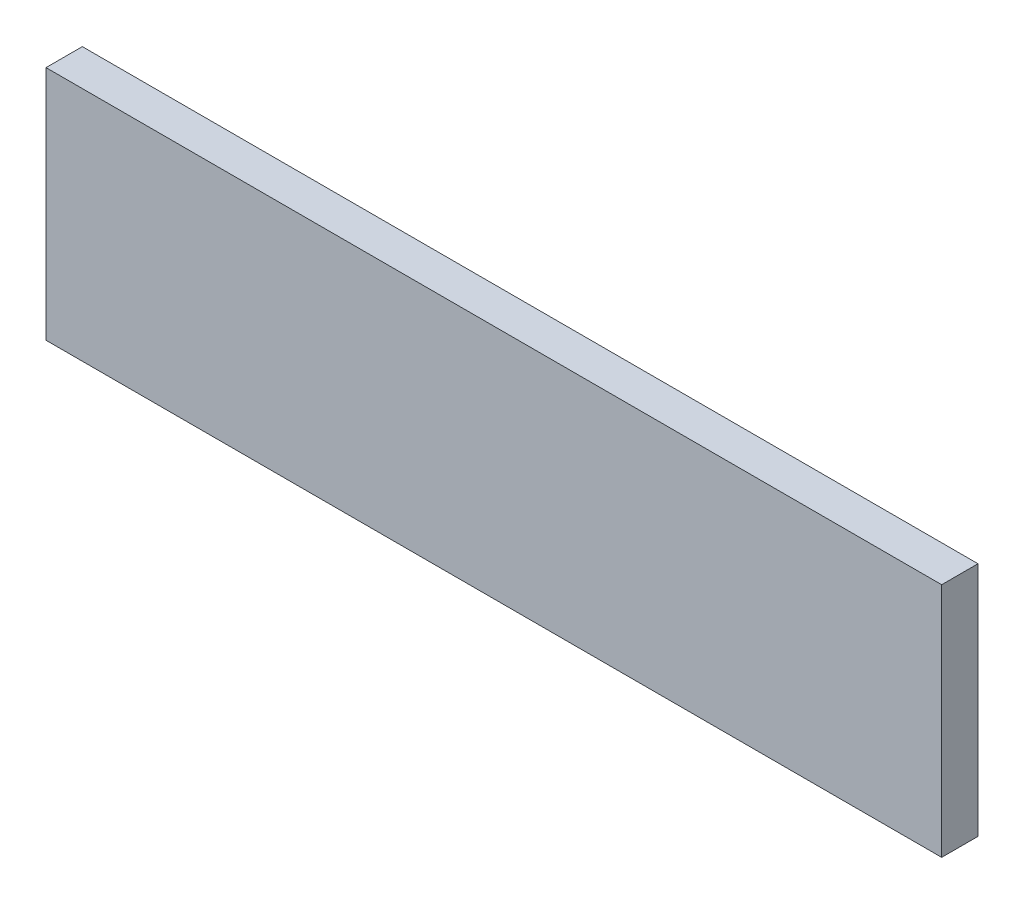
ISO-10303-21;
HEADER;
FILE_DESCRIPTION(('STEP AP214'),'2;1');
FILE_NAME('part.step','',(''),(''),'','','');
FILE_SCHEMA(('AUTOMOTIVE_DESIGN { 1 0 10303 214 1 1 1 1 }'));
ENDSEC;
DATA;
#1=APPLICATION_CONTEXT('core data for automotive mechanical design processes');
#2=APPLICATION_PROTOCOL_DEFINITION('international standard','automotive_design',2000,#1);
#3=PRODUCT_CONTEXT('',#1,'mechanical');
#4=PRODUCT('Part','Part','',(#3));
#5=PRODUCT_RELATED_PRODUCT_CATEGORY('part','',(#4));
#6=PRODUCT_DEFINITION_FORMATION('','',#4);
#7=PRODUCT_DEFINITION_CONTEXT('part definition',#1,'design');
#8=PRODUCT_DEFINITION('design','',#6,#7);
#9=PRODUCT_DEFINITION_SHAPE('','',#8);
#10=(LENGTH_UNIT() NAMED_UNIT(*) SI_UNIT(.MILLI.,.METRE.));
#11=(NAMED_UNIT(*) PLANE_ANGLE_UNIT() SI_UNIT($,.RADIAN.));
#12=(NAMED_UNIT(*) SI_UNIT($,.STERADIAN.) SOLID_ANGLE_UNIT());
#13=UNCERTAINTY_MEASURE_WITH_UNIT(LENGTH_MEASURE(1.E-05),#10,'distance_accuracy_value','');
#14=(GEOMETRIC_REPRESENTATION_CONTEXT(3) GLOBAL_UNCERTAINTY_ASSIGNED_CONTEXT((#13)) GLOBAL_UNIT_ASSIGNED_CONTEXT((#10,
#11,#12)) REPRESENTATION_CONTEXT('',''));
#15=CARTESIAN_POINT('',(0.,0.,0.));
#16=DIRECTION('',(0.,0.,1.));
#17=DIRECTION('',(1.,0.,0.));
#18=AXIS2_PLACEMENT_3D('',#15,#16,#17);
#19=CARTESIAN_POINT('',(156.549999955,41.275,12.7));
#20=DIRECTION('',(-1.,0.,0.));
#21=DIRECTION('',(0.,0.,1.));
#22=AXIS2_PLACEMENT_3D('',#19,#20,#21);
#23=PLANE('',#22);
#24=DIRECTION('',(0.,1.,0.));
#25=VECTOR('',#24,1.);
#26=CARTESIAN_POINT('',(156.549999955,41.275,0.));
#27=LINE('',#26,#25);
#28=CARTESIAN_POINT('',(156.549999955,-41.275,0.));
#29=VERTEX_POINT('',#28);
#30=CARTESIAN_POINT('',(156.549999955,41.275,0.));
#31=VERTEX_POINT('',#30);
#32=EDGE_CURVE('E106',#29,#31,#27,.T.);
#33=ORIENTED_EDGE('',*,*,#32,.T.);
#34=DIRECTION('',(0.,0.,-1.));
#35=VECTOR('',#34,1.);
#36=CARTESIAN_POINT('',(156.549999955,41.275,12.7));
#37=LINE('',#36,#35);
#38=CARTESIAN_POINT('',(156.549999955,41.275,12.7));
#39=VERTEX_POINT('',#38);
#40=EDGE_CURVE('E11',#39,#31,#37,.T.);
#41=ORIENTED_EDGE('',*,*,#40,.F.);
#42=DIRECTION('',(0.,1.,0.));
#43=VECTOR('',#42,1.);
#44=CARTESIAN_POINT('',(156.549999955,41.275,12.7));
#45=LINE('',#44,#43);
#46=CARTESIAN_POINT('',(156.549999955,-41.275,12.7));
#47=VERTEX_POINT('',#46);
#48=EDGE_CURVE('E90',#47,#39,#45,.T.);
#49=ORIENTED_EDGE('',*,*,#48,.F.);
#50=DIRECTION('',(0.,0.,-1.));
#51=VECTOR('',#50,1.);
#52=CARTESIAN_POINT('',(156.549999955,-41.275,12.7));
#53=LINE('',#52,#51);
#54=EDGE_CURVE('E102',#47,#29,#53,.T.);
#55=ORIENTED_EDGE('',*,*,#54,.T.);
#56=EDGE_LOOP('',(#33,#41,#49,#55));
#57=FACE_BOUND('',#56,.T.);
#58=ADVANCED_FACE('F38',(#57),#23,.F.);
#59=CARTESIAN_POINT('',(-156.549999955,41.275,12.7));
#60=DIRECTION('',(0.,-1.,0.));
#61=DIRECTION('',(0.,0.,-1.));
#62=AXIS2_PLACEMENT_3D('',#59,#60,#61);
#63=PLANE('',#62);
#64=DIRECTION('',(-1.,0.,0.));
#65=VECTOR('',#64,1.);
#66=CARTESIAN_POINT('',(-156.549999955,41.275,0.));
#67=LINE('',#66,#65);
#68=CARTESIAN_POINT('',(-156.549999955,41.275,0.));
#69=VERTEX_POINT('',#68);
#70=EDGE_CURVE('E95',#31,#69,#67,.T.);
#71=ORIENTED_EDGE('',*,*,#70,.T.);
#72=DIRECTION('',(0.,0.,-1.));
#73=VECTOR('',#72,1.);
#74=CARTESIAN_POINT('',(-156.549999955,41.275,12.7));
#75=LINE('',#74,#73);
#76=CARTESIAN_POINT('',(-156.549999955,41.275,12.7));
#77=VERTEX_POINT('',#76);
#78=EDGE_CURVE('E47',#77,#69,#75,.T.);
#79=ORIENTED_EDGE('',*,*,#78,.F.);
#80=DIRECTION('',(-1.,0.,0.));
#81=VECTOR('',#80,1.);
#82=CARTESIAN_POINT('',(-156.549999955,41.275,12.7));
#83=LINE('',#82,#81);
#84=EDGE_CURVE('E85',#39,#77,#83,.T.);
#85=ORIENTED_EDGE('',*,*,#84,.F.);
#86=ORIENTED_EDGE('',*,*,#40,.T.);
#87=EDGE_LOOP('',(#71,#79,#85,#86));
#88=FACE_BOUND('',#87,.T.);
#89=ADVANCED_FACE('F94',(#88),#63,.F.);
#90=CARTESIAN_POINT('',(-156.549999955,41.275,12.7));
#91=DIRECTION('',(1.,0.,0.));
#92=DIRECTION('',(0.,1.,0.));
#93=AXIS2_PLACEMENT_3D('',#90,#91,#92);
#94=PLANE('',#93);
#95=DIRECTION('',(0.,-1.,0.));
#96=VECTOR('',#95,1.);
#97=CARTESIAN_POINT('',(-156.549999955,41.275,0.));
#98=LINE('',#97,#96);
#99=CARTESIAN_POINT('',(-156.549999955,-41.275,0.));
#100=VERTEX_POINT('',#99);
#101=EDGE_CURVE('E72',#69,#100,#98,.T.);
#102=ORIENTED_EDGE('',*,*,#101,.T.);
#103=DIRECTION('',(0.,0.,-1.));
#104=VECTOR('',#103,1.);
#105=CARTESIAN_POINT('',(-156.549999955,-41.275,12.7));
#106=LINE('',#105,#104);
#107=CARTESIAN_POINT('',(-156.549999955,-41.275,12.7));
#108=VERTEX_POINT('',#107);
#109=EDGE_CURVE('E97',#108,#100,#106,.T.);
#110=ORIENTED_EDGE('',*,*,#109,.F.);
#111=DIRECTION('',(0.,-1.,0.));
#112=VECTOR('',#111,1.);
#113=CARTESIAN_POINT('',(-156.549999955,41.275,12.7));
#114=LINE('',#113,#112);
#115=EDGE_CURVE('E88',#77,#108,#114,.T.);
#116=ORIENTED_EDGE('',*,*,#115,.F.);
#117=ORIENTED_EDGE('',*,*,#78,.T.);
#118=EDGE_LOOP('',(#102,#110,#116,#117));
#119=FACE_BOUND('',#118,.T.);
#120=ADVANCED_FACE('F98',(#119),#94,.F.);
#121=CARTESIAN_POINT('',(-156.549999955,-41.275,12.7));
#122=DIRECTION('',(0.,1.,0.));
#123=DIRECTION('',(0.,0.,1.));
#124=AXIS2_PLACEMENT_3D('',#121,#122,#123);
#125=PLANE('',#124);
#126=DIRECTION('',(1.,0.,0.));
#127=VECTOR('',#126,1.);
#128=CARTESIAN_POINT('',(-156.549999955,-41.275,0.));
#129=LINE('',#128,#127);
#130=EDGE_CURVE('E78',#100,#29,#129,.T.);
#131=ORIENTED_EDGE('',*,*,#130,.T.);
#132=ORIENTED_EDGE('',*,*,#54,.F.);
#133=DIRECTION('',(1.,0.,0.));
#134=VECTOR('',#133,1.);
#135=CARTESIAN_POINT('',(-156.549999955,-41.275,12.7));
#136=LINE('',#135,#134);
#137=EDGE_CURVE('E55',#108,#47,#136,.T.);
#138=ORIENTED_EDGE('',*,*,#137,.F.);
#139=ORIENTED_EDGE('',*,*,#109,.T.);
#140=EDGE_LOOP('',(#131,#132,#138,#139));
#141=FACE_BOUND('',#140,.T.);
#142=ADVANCED_FACE('F119',(#141),#125,.F.);
#143=CARTESIAN_POINT('',(0.,0.,12.7));
#144=DIRECTION('',(0.,0.,1.));
#145=DIRECTION('',(1.,0.,0.));
#146=AXIS2_PLACEMENT_3D('',#143,#144,#145);
#147=PLANE('',#146);
#148=ORIENTED_EDGE('',*,*,#48,.T.);
#149=ORIENTED_EDGE('',*,*,#84,.T.);
#150=ORIENTED_EDGE('',*,*,#115,.T.);
#151=ORIENTED_EDGE('',*,*,#137,.T.);
#152=EDGE_LOOP('',(#148,#149,#150,#151));
#153=FACE_BOUND('',#152,.T.);
#154=ADVANCED_FACE('F86',(#153),#147,.T.);
#155=CARTESIAN_POINT('',(0.,0.,0.));
#156=DIRECTION('',(0.,0.,1.));
#157=DIRECTION('',(1.,0.,0.));
#158=AXIS2_PLACEMENT_3D('',#155,#156,#157);
#159=PLANE('',#158);
#160=ORIENTED_EDGE('',*,*,#32,.F.);
#161=ORIENTED_EDGE('',*,*,#130,.F.);
#162=ORIENTED_EDGE('',*,*,#101,.F.);
#163=ORIENTED_EDGE('',*,*,#70,.F.);
#164=EDGE_LOOP('',(#160,#161,#162,#163));
#165=FACE_BOUND('',#164,.T.);
#166=ADVANCED_FACE('F122',(#165),#159,.F.);
#167=CLOSED_SHELL('',(#58,#89,#120,#142,#154,#166));
#168=MANIFOLD_SOLID_BREP('B2',#167);
#169=ADVANCED_BREP_SHAPE_REPRESENTATION('',(#18,#168),#14);
#170=SHAPE_DEFINITION_REPRESENTATION(#9,#169);
ENDSEC;
END-ISO-10303-21;
